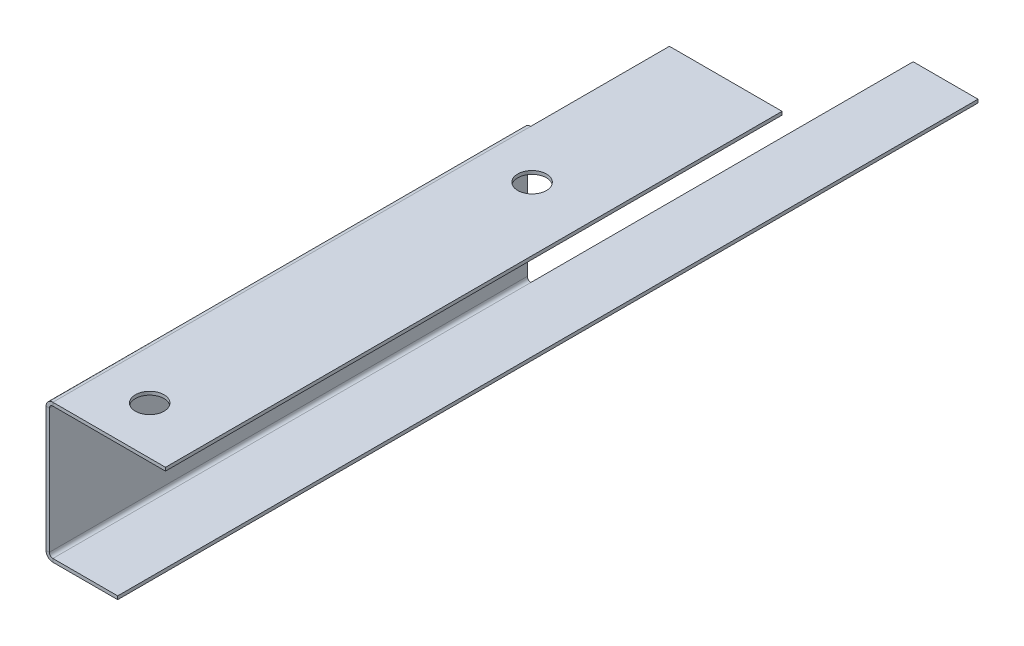
ISO-10303-21;
HEADER;
FILE_DESCRIPTION(('STEP AP214'),'2;1');
FILE_NAME('part.step','',(''),(''),'','','');
FILE_SCHEMA(('AUTOMOTIVE_DESIGN { 1 0 10303 214 1 1 1 1 }'));
ENDSEC;
DATA;
#1=APPLICATION_CONTEXT('core data for automotive mechanical design processes');
#2=APPLICATION_PROTOCOL_DEFINITION('international standard','automotive_design',2000,#1);
#3=PRODUCT_CONTEXT('',#1,'mechanical');
#4=PRODUCT('Part','Part','',(#3));
#5=PRODUCT_RELATED_PRODUCT_CATEGORY('part','',(#4));
#6=PRODUCT_DEFINITION_FORMATION('','',#4);
#7=PRODUCT_DEFINITION_CONTEXT('part definition',#1,'design');
#8=PRODUCT_DEFINITION('design','',#6,#7);
#9=PRODUCT_DEFINITION_SHAPE('','',#8);
#10=(LENGTH_UNIT() NAMED_UNIT(*) SI_UNIT(.MILLI.,.METRE.));
#11=(NAMED_UNIT(*) PLANE_ANGLE_UNIT() SI_UNIT($,.RADIAN.));
#12=(NAMED_UNIT(*) SI_UNIT($,.STERADIAN.) SOLID_ANGLE_UNIT());
#13=UNCERTAINTY_MEASURE_WITH_UNIT(LENGTH_MEASURE(1.E-05),#10,'distance_accuracy_value','');
#14=(GEOMETRIC_REPRESENTATION_CONTEXT(3) GLOBAL_UNCERTAINTY_ASSIGNED_CONTEXT((#13)) GLOBAL_UNIT_ASSIGNED_CONTEXT((#10,
#11,#12)) REPRESENTATION_CONTEXT('',''));
#15=CARTESIAN_POINT('',(0.,0.,0.));
#16=DIRECTION('',(0.,0.,1.));
#17=DIRECTION('',(1.,0.,0.));
#18=AXIS2_PLACEMENT_3D('',#15,#16,#17);
#19=CARTESIAN_POINT('',(0.,1.4366,100.));
#20=DIRECTION('',(0.,0.,1.));
#21=DIRECTION('',(1.,0.,0.));
#22=AXIS2_PLACEMENT_3D('',#19,#20,#21);
#23=PLANE('',#22);
#24=DIRECTION('',(1.,0.,0.));
#25=VECTOR('',#24,1.);
#26=CARTESIAN_POINT('',(0.,1.4366,100.));
#27=LINE('',#26,#25);
#28=CARTESIAN_POINT('',(0.,1.4366,100.));
#29=VERTEX_POINT('',#28);
#30=CARTESIAN_POINT('',(0.7,1.4366,100.));
#31=VERTEX_POINT('',#30);
#32=EDGE_CURVE('E11',#29,#31,#27,.T.);
#33=ORIENTED_EDGE('',*,*,#32,.F.);
#34=CARTESIAN_POINT('',(1.4366,1.4366,100.));
#35=DIRECTION('',(0.,0.,1.));
#36=DIRECTION('',(1.,0.,0.));
#37=AXIS2_PLACEMENT_3D('',#34,#35,#36);
#38=CIRCLE('',#37,1.4366);
#39=CARTESIAN_POINT('',(1.4366,0.,100.));
#40=VERTEX_POINT('',#39);
#41=EDGE_CURVE('E225',#40,#29,#38,.F.);
#42=ORIENTED_EDGE('',*,*,#41,.F.);
#43=DIRECTION('',(0.,-1.,0.));
#44=VECTOR('',#43,1.);
#45=CARTESIAN_POINT('',(1.4366,0.7,100.));
#46=LINE('',#45,#44);
#47=CARTESIAN_POINT('',(1.4366,0.7,100.));
#48=VERTEX_POINT('',#47);
#49=EDGE_CURVE('E46',#48,#40,#46,.T.);
#50=ORIENTED_EDGE('',*,*,#49,.F.);
#51=CARTESIAN_POINT('',(1.4366,1.4366,100.));
#52=DIRECTION('',(0.,0.,1.));
#53=DIRECTION('',(1.,0.,0.));
#54=AXIS2_PLACEMENT_3D('',#51,#52,#53);
#55=CIRCLE('',#54,0.7366);
#56=EDGE_CURVE('E137',#48,#31,#55,.F.);
#57=ORIENTED_EDGE('',*,*,#56,.T.);
#58=EDGE_LOOP('',(#33,#42,#50,#57));
#59=FACE_BOUND('',#58,.T.);
#60=ADVANCED_FACE('F38',(#59),#23,.T.);
#61=CARTESIAN_POINT('',(1.4366,0.7,100.));
#62=DIRECTION('',(0.,0.,1.));
#63=DIRECTION('',(1.,0.,0.));
#64=AXIS2_PLACEMENT_3D('',#61,#62,#63);
#65=PLANE('',#64);
#66=DIRECTION('',(0.,1.,0.));
#67=VECTOR('',#66,1.);
#68=CARTESIAN_POINT('',(0.,0.,100.));
#69=LINE('',#68,#67);
#70=CARTESIAN_POINT('',(0.,27.5634,100.));
#71=VERTEX_POINT('',#70);
#72=EDGE_CURVE('E131',#29,#71,#69,.T.);
#73=ORIENTED_EDGE('',*,*,#72,.F.);
#74=ORIENTED_EDGE('',*,*,#32,.T.);
#75=DIRECTION('',(0.,1.,0.));
#76=VECTOR('',#75,1.);
#77=CARTESIAN_POINT('',(0.7,0.,100.));
#78=LINE('',#77,#76);
#79=CARTESIAN_POINT('',(0.7,27.5634,100.));
#80=VERTEX_POINT('',#79);
#81=EDGE_CURVE('E128',#31,#80,#78,.T.);
#82=ORIENTED_EDGE('',*,*,#81,.T.);
#83=DIRECTION('',(-1.,0.,0.));
#84=VECTOR('',#83,1.);
#85=CARTESIAN_POINT('',(0.7,27.5634,100.));
#86=LINE('',#85,#84);
#87=EDGE_CURVE('E205',#80,#71,#86,.T.);
#88=ORIENTED_EDGE('',*,*,#87,.T.);
#89=EDGE_LOOP('',(#73,#74,#82,#88));
#90=FACE_BOUND('',#89,.T.);
#91=ADVANCED_FACE('F126',(#90),#65,.T.);
#92=CARTESIAN_POINT('',(1.4366,0.,0.));
#93=DIRECTION('',(0.,0.,-1.));
#94=DIRECTION('',(-1.,0.,0.));
#95=AXIS2_PLACEMENT_3D('',#92,#93,#94);
#96=PLANE('',#95);
#97=DIRECTION('',(0.,1.,0.));
#98=VECTOR('',#97,1.);
#99=CARTESIAN_POINT('',(1.4366,0.,0.));
#100=LINE('',#99,#98);
#101=CARTESIAN_POINT('',(1.4366,0.,0.));
#102=VERTEX_POINT('',#101);
#103=CARTESIAN_POINT('',(1.4366,0.7,0.));
#104=VERTEX_POINT('',#103);
#105=EDGE_CURVE('E210',#102,#104,#100,.T.);
#106=ORIENTED_EDGE('',*,*,#105,.F.);
#107=CARTESIAN_POINT('',(1.4366,1.4366,0.));
#108=DIRECTION('',(0.,0.,1.));
#109=DIRECTION('',(1.,0.,0.));
#110=AXIS2_PLACEMENT_3D('',#107,#108,#109);
#111=CIRCLE('',#110,1.4366);
#112=CARTESIAN_POINT('',(0.,1.4366,0.));
#113=VERTEX_POINT('',#112);
#114=EDGE_CURVE('E168',#102,#113,#111,.F.);
#115=ORIENTED_EDGE('',*,*,#114,.T.);
#116=DIRECTION('',(-1.,0.,0.));
#117=VECTOR('',#116,1.);
#118=CARTESIAN_POINT('',(0.7,1.4366,0.));
#119=LINE('',#118,#117);
#120=CARTESIAN_POINT('',(0.7,1.4366,0.));
#121=VERTEX_POINT('',#120);
#122=EDGE_CURVE('E208',#121,#113,#119,.T.);
#123=ORIENTED_EDGE('',*,*,#122,.F.);
#124=CARTESIAN_POINT('',(1.4366,1.4366,0.));
#125=DIRECTION('',(0.,0.,1.));
#126=DIRECTION('',(1.,0.,0.));
#127=AXIS2_PLACEMENT_3D('',#124,#125,#126);
#128=CIRCLE('',#127,0.7366);
#129=EDGE_CURVE('E149',#104,#121,#128,.F.);
#130=ORIENTED_EDGE('',*,*,#129,.F.);
#131=EDGE_LOOP('',(#106,#115,#123,#130));
#132=FACE_BOUND('',#131,.T.);
#133=ADVANCED_FACE('F338',(#132),#96,.T.);
#134=CARTESIAN_POINT('',(1.4366,29.,100.));
#135=DIRECTION('',(0.,0.,1.));
#136=DIRECTION('',(1.,0.,0.));
#137=AXIS2_PLACEMENT_3D('',#134,#135,#136);
#138=PLANE('',#137);
#139=DIRECTION('',(0.,-1.,0.));
#140=VECTOR('',#139,1.);
#141=CARTESIAN_POINT('',(1.4366,29.,100.));
#142=LINE('',#141,#140);
#143=CARTESIAN_POINT('',(1.4366,29.,100.));
#144=VERTEX_POINT('',#143);
#145=CARTESIAN_POINT('',(1.4366,28.3,100.));
#146=VERTEX_POINT('',#145);
#147=EDGE_CURVE('E54',#144,#146,#142,.T.);
#148=ORIENTED_EDGE('',*,*,#147,.F.);
#149=CARTESIAN_POINT('',(1.4366,27.5634,100.));
#150=DIRECTION('',(0.,0.,1.));
#151=DIRECTION('',(1.,0.,0.));
#152=AXIS2_PLACEMENT_3D('',#149,#150,#151);
#153=CIRCLE('',#152,1.4366);
#154=EDGE_CURVE('E237',#71,#144,#153,.F.);
#155=ORIENTED_EDGE('',*,*,#154,.F.);
#156=ORIENTED_EDGE('',*,*,#87,.F.);
#157=CARTESIAN_POINT('',(1.4366,27.5634,100.));
#158=DIRECTION('',(0.,0.,1.));
#159=DIRECTION('',(1.,0.,0.));
#160=AXIS2_PLACEMENT_3D('',#157,#158,#159);
#161=CIRCLE('',#160,0.7366);
#162=EDGE_CURVE('E157',#80,#146,#161,.F.);
#163=ORIENTED_EDGE('',*,*,#162,.T.);
#164=EDGE_LOOP('',(#148,#155,#156,#163));
#165=FACE_BOUND('',#164,.T.);
#166=ADVANCED_FACE('F332',(#165),#138,.T.);
#167=CARTESIAN_POINT('',(0.7,27.5634,100.));
#168=DIRECTION('',(0.,0.,1.));
#169=DIRECTION('',(1.,0.,0.));
#170=AXIS2_PLACEMENT_3D('',#167,#168,#169);
#171=PLANE('',#170);
#172=DIRECTION('',(1.,0.,0.));
#173=VECTOR('',#172,1.);
#174=CARTESIAN_POINT('',(0.,29.,100.));
#175=LINE('',#174,#173);
#176=CARTESIAN_POINT('',(25.,29.,100.));
#177=VERTEX_POINT('',#176);
#178=EDGE_CURVE('E240',#144,#177,#175,.T.);
#179=ORIENTED_EDGE('',*,*,#178,.F.);
#180=ORIENTED_EDGE('',*,*,#147,.T.);
#181=DIRECTION('',(1.,0.,0.));
#182=VECTOR('',#181,1.);
#183=CARTESIAN_POINT('',(0.,28.3,100.));
#184=LINE('',#183,#182);
#185=CARTESIAN_POINT('',(25.,28.3,100.));
#186=VERTEX_POINT('',#185);
#187=EDGE_CURVE('E95',#146,#186,#184,.T.);
#188=ORIENTED_EDGE('',*,*,#187,.T.);
#189=DIRECTION('',(0.,-1.,0.));
#190=VECTOR('',#189,1.);
#191=CARTESIAN_POINT('',(25.,29.,100.));
#192=LINE('',#191,#190);
#193=EDGE_CURVE('E243',#177,#186,#192,.T.);
#194=ORIENTED_EDGE('',*,*,#193,.F.);
#195=EDGE_LOOP('',(#179,#180,#188,#194));
#196=FACE_BOUND('',#195,.T.);
#197=ADVANCED_FACE('F328',(#196),#171,.T.);
#198=CARTESIAN_POINT('',(0.,27.5634,0.));
#199=DIRECTION('',(0.,0.,-1.));
#200=DIRECTION('',(-1.,0.,0.));
#201=AXIS2_PLACEMENT_3D('',#198,#199,#200);
#202=PLANE('',#201);
#203=DIRECTION('',(1.,0.,0.));
#204=VECTOR('',#203,1.);
#205=CARTESIAN_POINT('',(0.,27.5634,0.));
#206=LINE('',#205,#204);
#207=CARTESIAN_POINT('',(0.,27.5634,0.));
#208=VERTEX_POINT('',#207);
#209=CARTESIAN_POINT('',(0.7,27.5634,0.));
#210=VERTEX_POINT('',#209);
#211=EDGE_CURVE('E81',#208,#210,#206,.T.);
#212=ORIENTED_EDGE('',*,*,#211,.F.);
#213=CARTESIAN_POINT('',(1.4366,27.5634,0.));
#214=DIRECTION('',(0.,0.,1.));
#215=DIRECTION('',(1.,0.,0.));
#216=AXIS2_PLACEMENT_3D('',#213,#214,#215);
#217=CIRCLE('',#216,1.4366);
#218=CARTESIAN_POINT('',(1.4366,29.,0.));
#219=VERTEX_POINT('',#218);
#220=EDGE_CURVE('E163',#208,#219,#217,.F.);
#221=ORIENTED_EDGE('',*,*,#220,.T.);
#222=DIRECTION('',(0.,1.,0.));
#223=VECTOR('',#222,1.);
#224=CARTESIAN_POINT('',(1.4366,28.3,0.));
#225=LINE('',#224,#223);
#226=CARTESIAN_POINT('',(1.4366,28.3,0.));
#227=VERTEX_POINT('',#226);
#228=EDGE_CURVE('E89',#227,#219,#225,.T.);
#229=ORIENTED_EDGE('',*,*,#228,.F.);
#230=CARTESIAN_POINT('',(1.4366,27.5634,0.));
#231=DIRECTION('',(0.,0.,1.));
#232=DIRECTION('',(1.,0.,0.));
#233=AXIS2_PLACEMENT_3D('',#230,#231,#232);
#234=CIRCLE('',#233,0.7366);
#235=EDGE_CURVE('E174',#210,#227,#234,.F.);
#236=ORIENTED_EDGE('',*,*,#235,.F.);
#237=EDGE_LOOP('',(#212,#221,#229,#236));
#238=FACE_BOUND('',#237,.T.);
#239=ADVANCED_FACE('F383',(#238),#202,.T.);
#240=CARTESIAN_POINT('',(1.4366,28.3,0.));
#241=DIRECTION('',(0.,0.,-1.));
#242=DIRECTION('',(-1.,0.,0.));
#243=AXIS2_PLACEMENT_3D('',#240,#241,#242);
#244=PLANE('',#243);
#245=DIRECTION('',(0.,1.,0.));
#246=VECTOR('',#245,1.);
#247=CARTESIAN_POINT('',(0.,0.,0.));
#248=LINE('',#247,#246);
#249=EDGE_CURVE('E165',#113,#208,#248,.T.);
#250=ORIENTED_EDGE('',*,*,#249,.T.);
#251=ORIENTED_EDGE('',*,*,#211,.T.);
#252=DIRECTION('',(0.,1.,0.));
#253=VECTOR('',#252,1.);
#254=CARTESIAN_POINT('',(0.7,0.,0.));
#255=LINE('',#254,#253);
#256=EDGE_CURVE('E172',#121,#210,#255,.T.);
#257=ORIENTED_EDGE('',*,*,#256,.F.);
#258=ORIENTED_EDGE('',*,*,#122,.T.);
#259=EDGE_LOOP('',(#250,#251,#257,#258));
#260=FACE_BOUND('',#259,.T.);
#261=ADVANCED_FACE('F386',(#260),#244,.T.);
#262=CARTESIAN_POINT('',(0.,28.3,100.));
#263=DIRECTION('',(0.,1.,0.));
#264=DIRECTION('',(0.,0.,1.));
#265=AXIS2_PLACEMENT_3D('',#262,#263,#264);
#266=PLANE('',#265);
#267=CARTESIAN_POINT('',(11.6999999999997,28.3,10.));
#268=DIRECTION('',(0.,1.,0.));
#269=DIRECTION('',(0.,0.,1.));
#270=AXIS2_PLACEMENT_3D('',#267,#268,#269);
#271=CIRCLE('',#270,3.);
#272=CARTESIAN_POINT('',(11.6999999999997,28.3,13.));
#273=VERTEX_POINT('',#272);
#274=EDGE_CURVE('E284',#273,#273,#271,.T.);
#275=ORIENTED_EDGE('',*,*,#274,.T.);
#276=EDGE_LOOP('',(#275));
#277=FACE_BOUND('',#276,.T.);
#278=CARTESIAN_POINT('',(11.7,28.3,90.));
#279=DIRECTION('',(0.,1.,0.));
#280=DIRECTION('',(0.,0.,1.));
#281=AXIS2_PLACEMENT_3D('',#278,#279,#280);
#282=CIRCLE('',#281,3.);
#283=CARTESIAN_POINT('',(11.7,28.3,93.));
#284=VERTEX_POINT('',#283);
#285=EDGE_CURVE('E276',#284,#284,#282,.T.);
#286=ORIENTED_EDGE('',*,*,#285,.T.);
#287=EDGE_LOOP('',(#286));
#288=FACE_BOUND('',#287,.T.);
#289=DIRECTION('',(0.,0.,-1.));
#290=VECTOR('',#289,1.);
#291=CARTESIAN_POINT('',(1.4366,28.3,100.));
#292=LINE('',#291,#290);
#293=EDGE_CURVE('E159',#146,#227,#292,.T.);
#294=ORIENTED_EDGE('',*,*,#293,.T.);
#295=DIRECTION('',(0.,0.,1.));
#296=VECTOR('',#295,1.);
#297=CARTESIAN_POINT('',(1.4366,28.3,0.));
#298=LINE('',#297,#296);
#299=CARTESIAN_POINT('',(1.4366,28.3,-29.));
#300=VERTEX_POINT('',#299);
#301=EDGE_CURVE('E256',#300,#227,#298,.T.);
#302=ORIENTED_EDGE('',*,*,#301,.F.);
#303=DIRECTION('',(-1.,0.,0.));
#304=VECTOR('',#303,1.);
#305=CARTESIAN_POINT('',(1.4366,28.3,-29.));
#306=LINE('',#305,#304);
#307=CARTESIAN_POINT('',(25.,28.3,-29.));
#308=VERTEX_POINT('',#307);
#309=EDGE_CURVE('E250',#308,#300,#306,.T.);
#310=ORIENTED_EDGE('',*,*,#309,.F.);
#311=DIRECTION('',(0.,0.,-1.));
#312=VECTOR('',#311,1.);
#313=CARTESIAN_POINT('',(25.,28.3,100.));
#314=LINE('',#313,#312);
#315=EDGE_CURVE('E200',#186,#308,#314,.T.);
#316=ORIENTED_EDGE('',*,*,#315,.F.);
#317=ORIENTED_EDGE('',*,*,#187,.F.);
#318=EDGE_LOOP('',(#294,#302,#310,#316,#317));
#319=FACE_BOUND('',#318,.T.);
#320=ADVANCED_FACE('F293',(#277,#288,#319),#266,.F.);
#321=CARTESIAN_POINT('',(25.,29.,100.));
#322=DIRECTION('',(1.,0.,0.));
#323=DIRECTION('',(0.,0.,-1.));
#324=AXIS2_PLACEMENT_3D('',#321,#322,#323);
#325=PLANE('',#324);
#326=ORIENTED_EDGE('',*,*,#315,.T.);
#327=DIRECTION('',(0.,1.,0.));
#328=VECTOR('',#327,1.);
#329=CARTESIAN_POINT('',(25.,28.3,-29.));
#330=LINE('',#329,#328);
#331=CARTESIAN_POINT('',(25.,29.,-29.));
#332=VERTEX_POINT('',#331);
#333=EDGE_CURVE('E247',#308,#332,#330,.T.);
#334=ORIENTED_EDGE('',*,*,#333,.T.);
#335=DIRECTION('',(0.,0.,-1.));
#336=VECTOR('',#335,1.);
#337=CARTESIAN_POINT('',(25.,29.,100.));
#338=LINE('',#337,#336);
#339=EDGE_CURVE('E197',#177,#332,#338,.T.);
#340=ORIENTED_EDGE('',*,*,#339,.F.);
#341=ORIENTED_EDGE('',*,*,#193,.T.);
#342=EDGE_LOOP('',(#326,#334,#340,#341));
#343=FACE_BOUND('',#342,.T.);
#344=ADVANCED_FACE('F307',(#343),#325,.T.);
#345=CARTESIAN_POINT('',(0.,29.,100.));
#346=DIRECTION('',(0.,1.,0.));
#347=DIRECTION('',(0.,0.,1.));
#348=AXIS2_PLACEMENT_3D('',#345,#346,#347);
#349=PLANE('',#348);
#350=CARTESIAN_POINT('',(11.6999999999997,29.,10.));
#351=DIRECTION('',(0.,1.,0.));
#352=DIRECTION('',(0.,0.,1.));
#353=AXIS2_PLACEMENT_3D('',#350,#351,#352);
#354=CIRCLE('',#353,3.);
#355=CARTESIAN_POINT('',(11.6999999999997,29.,13.));
#356=VERTEX_POINT('',#355);
#357=EDGE_CURVE('E287',#356,#356,#354,.T.);
#358=ORIENTED_EDGE('',*,*,#357,.F.);
#359=EDGE_LOOP('',(#358));
#360=FACE_BOUND('',#359,.T.);
#361=CARTESIAN_POINT('',(11.7,29.,90.));
#362=DIRECTION('',(0.,1.,0.));
#363=DIRECTION('',(0.,0.,1.));
#364=AXIS2_PLACEMENT_3D('',#361,#362,#363);
#365=CIRCLE('',#364,3.);
#366=CARTESIAN_POINT('',(11.7,29.,93.));
#367=VERTEX_POINT('',#366);
#368=EDGE_CURVE('E281',#367,#367,#365,.T.);
#369=ORIENTED_EDGE('',*,*,#368,.F.);
#370=EDGE_LOOP('',(#369));
#371=FACE_BOUND('',#370,.T.);
#372=ORIENTED_EDGE('',*,*,#339,.T.);
#373=DIRECTION('',(-1.,0.,0.));
#374=VECTOR('',#373,1.);
#375=CARTESIAN_POINT('',(1.4366,29.,-29.));
#376=LINE('',#375,#374);
#377=CARTESIAN_POINT('',(1.4366,29.,-29.));
#378=VERTEX_POINT('',#377);
#379=EDGE_CURVE('E253',#332,#378,#376,.T.);
#380=ORIENTED_EDGE('',*,*,#379,.T.);
#381=DIRECTION('',(0.,0.,1.));
#382=VECTOR('',#381,1.);
#383=CARTESIAN_POINT('',(1.4366,29.,0.));
#384=LINE('',#383,#382);
#385=EDGE_CURVE('E257',#378,#219,#384,.T.);
#386=ORIENTED_EDGE('',*,*,#385,.T.);
#387=DIRECTION('',(0.,0.,-1.));
#388=VECTOR('',#387,1.);
#389=CARTESIAN_POINT('',(1.4366,29.,100.));
#390=LINE('',#389,#388);
#391=EDGE_CURVE('E195',#144,#219,#390,.T.);
#392=ORIENTED_EDGE('',*,*,#391,.F.);
#393=ORIENTED_EDGE('',*,*,#178,.T.);
#394=EDGE_LOOP('',(#372,#380,#386,#392,#393));
#395=FACE_BOUND('',#394,.T.);
#396=ADVANCED_FACE('F303',(#360,#371,#395),#349,.T.);
#397=CARTESIAN_POINT('',(1.4366,27.5634,100.));
#398=DIRECTION('',(0.,0.,-1.));
#399=DIRECTION('',(-1.,0.,0.));
#400=AXIS2_PLACEMENT_3D('',#397,#398,#399);
#401=CYLINDRICAL_SURFACE('',#400,1.4366);
#402=ORIENTED_EDGE('',*,*,#220,.F.);
#403=DIRECTION('',(0.,0.,-1.));
#404=VECTOR('',#403,1.);
#405=CARTESIAN_POINT('',(0.,27.5634,100.));
#406=LINE('',#405,#404);
#407=EDGE_CURVE('E192',#71,#208,#406,.T.);
#408=ORIENTED_EDGE('',*,*,#407,.F.);
#409=ORIENTED_EDGE('',*,*,#154,.T.);
#410=ORIENTED_EDGE('',*,*,#391,.T.);
#411=EDGE_LOOP('',(#402,#408,#409,#410));
#412=FACE_BOUND('',#411,.T.);
#413=ADVANCED_FACE('F306',(#412),#401,.T.);
#414=CARTESIAN_POINT('',(0.,0.,100.));
#415=DIRECTION('',(-1.,0.,0.));
#416=DIRECTION('',(0.,0.,1.));
#417=AXIS2_PLACEMENT_3D('',#414,#415,#416);
#418=PLANE('',#417);
#419=ORIENTED_EDGE('',*,*,#249,.F.);
#420=DIRECTION('',(0.,0.,-1.));
#421=VECTOR('',#420,1.);
#422=CARTESIAN_POINT('',(0.,1.4366,100.));
#423=LINE('',#422,#421);
#424=EDGE_CURVE('E189',#29,#113,#423,.T.);
#425=ORIENTED_EDGE('',*,*,#424,.F.);
#426=ORIENTED_EDGE('',*,*,#72,.T.);
#427=ORIENTED_EDGE('',*,*,#407,.T.);
#428=EDGE_LOOP('',(#419,#425,#426,#427));
#429=FACE_BOUND('',#428,.T.);
#430=ADVANCED_FACE('F335',(#429),#418,.T.);
#431=CARTESIAN_POINT('',(1.4366,1.4366,100.));
#432=DIRECTION('',(0.,0.,-1.));
#433=DIRECTION('',(-1.,0.,0.));
#434=AXIS2_PLACEMENT_3D('',#431,#432,#433);
#435=CYLINDRICAL_SURFACE('',#434,1.4366);
#436=ORIENTED_EDGE('',*,*,#114,.F.);
#437=DIRECTION('',(0.,0.,-1.));
#438=VECTOR('',#437,1.);
#439=CARTESIAN_POINT('',(1.4366,0.,100.));
#440=LINE('',#439,#438);
#441=EDGE_CURVE('E186',#40,#102,#440,.T.);
#442=ORIENTED_EDGE('',*,*,#441,.F.);
#443=ORIENTED_EDGE('',*,*,#41,.T.);
#444=ORIENTED_EDGE('',*,*,#424,.T.);
#445=EDGE_LOOP('',(#436,#442,#443,#444));
#446=FACE_BOUND('',#445,.T.);
#447=ADVANCED_FACE('F224',(#446),#435,.T.);
#448=CARTESIAN_POINT('',(0.,0.,100.));
#449=DIRECTION('',(0.,-1.,0.));
#450=DIRECTION('',(0.,0.,-1.));
#451=AXIS2_PLACEMENT_3D('',#448,#449,#450);
#452=PLANE('',#451);
#453=ORIENTED_EDGE('',*,*,#441,.T.);
#454=DIRECTION('',(0.,0.,-1.));
#455=VECTOR('',#454,1.);
#456=CARTESIAN_POINT('',(1.4366,0.,0.));
#457=LINE('',#456,#455);
#458=CARTESIAN_POINT('',(1.4366,0.,-80.));
#459=VERTEX_POINT('',#458);
#460=EDGE_CURVE('E274',#102,#459,#457,.T.);
#461=ORIENTED_EDGE('',*,*,#460,.T.);
#462=DIRECTION('',(1.,0.,0.));
#463=VECTOR('',#462,1.);
#464=CARTESIAN_POINT('',(15.,0.,-80.));
#465=LINE('',#464,#463);
#466=CARTESIAN_POINT('',(15.,0.,-80.));
#467=VERTEX_POINT('',#466);
#468=EDGE_CURVE('E271',#459,#467,#465,.T.);
#469=ORIENTED_EDGE('',*,*,#468,.T.);
#470=DIRECTION('',(0.,0.,-1.));
#471=VECTOR('',#470,1.);
#472=CARTESIAN_POINT('',(15.,0.,100.));
#473=LINE('',#472,#471);
#474=CARTESIAN_POINT('',(15.,0.,100.));
#475=VERTEX_POINT('',#474);
#476=EDGE_CURVE('E183',#475,#467,#473,.T.);
#477=ORIENTED_EDGE('',*,*,#476,.F.);
#478=DIRECTION('',(-1.,0.,0.));
#479=VECTOR('',#478,1.);
#480=CARTESIAN_POINT('',(0.,0.,100.));
#481=LINE('',#480,#479);
#482=EDGE_CURVE('E218',#475,#40,#481,.T.);
#483=ORIENTED_EDGE('',*,*,#482,.T.);
#484=EDGE_LOOP('',(#453,#461,#469,#477,#483));
#485=FACE_BOUND('',#484,.T.);
#486=ADVANCED_FACE('F230',(#485),#452,.T.);
#487=CARTESIAN_POINT('',(15.,0.7,100.));
#488=DIRECTION('',(1.,0.,0.));
#489=DIRECTION('',(0.,0.,-1.));
#490=AXIS2_PLACEMENT_3D('',#487,#488,#489);
#491=PLANE('',#490);
#492=ORIENTED_EDGE('',*,*,#476,.T.);
#493=DIRECTION('',(0.,-1.,0.));
#494=VECTOR('',#493,1.);
#495=CARTESIAN_POINT('',(15.,0.7,-80.));
#496=LINE('',#495,#494);
#497=CARTESIAN_POINT('',(15.,0.7,-80.));
#498=VERTEX_POINT('',#497);
#499=EDGE_CURVE('E260',#498,#467,#496,.T.);
#500=ORIENTED_EDGE('',*,*,#499,.F.);
#501=DIRECTION('',(0.,0.,-1.));
#502=VECTOR('',#501,1.);
#503=CARTESIAN_POINT('',(15.,0.7,100.));
#504=LINE('',#503,#502);
#505=CARTESIAN_POINT('',(15.,0.7,100.));
#506=VERTEX_POINT('',#505);
#507=EDGE_CURVE('E180',#506,#498,#504,.T.);
#508=ORIENTED_EDGE('',*,*,#507,.F.);
#509=DIRECTION('',(0.,-1.,0.));
#510=VECTOR('',#509,1.);
#511=CARTESIAN_POINT('',(15.,0.7,100.));
#512=LINE('',#511,#510);
#513=EDGE_CURVE('E232',#506,#475,#512,.T.);
#514=ORIENTED_EDGE('',*,*,#513,.T.);
#515=EDGE_LOOP('',(#492,#500,#508,#514));
#516=FACE_BOUND('',#515,.T.);
#517=ADVANCED_FACE('F361',(#516),#491,.T.);
#518=CARTESIAN_POINT('',(0.,0.7,100.));
#519=DIRECTION('',(0.,-1.,0.));
#520=DIRECTION('',(0.,0.,-1.));
#521=AXIS2_PLACEMENT_3D('',#518,#519,#520);
#522=PLANE('',#521);
#523=ORIENTED_EDGE('',*,*,#507,.T.);
#524=DIRECTION('',(1.,0.,0.));
#525=VECTOR('',#524,1.);
#526=CARTESIAN_POINT('',(15.,0.7,-80.));
#527=LINE('',#526,#525);
#528=CARTESIAN_POINT('',(1.4366,0.7,-80.));
#529=VERTEX_POINT('',#528);
#530=EDGE_CURVE('E268',#529,#498,#527,.T.);
#531=ORIENTED_EDGE('',*,*,#530,.F.);
#532=DIRECTION('',(0.,0.,-1.));
#533=VECTOR('',#532,1.);
#534=CARTESIAN_POINT('',(1.4366,0.7,0.));
#535=LINE('',#534,#533);
#536=EDGE_CURVE('E273',#104,#529,#535,.T.);
#537=ORIENTED_EDGE('',*,*,#536,.F.);
#538=DIRECTION('',(0.,0.,-1.));
#539=VECTOR('',#538,1.);
#540=CARTESIAN_POINT('',(1.4366,0.7,100.));
#541=LINE('',#540,#539);
#542=EDGE_CURVE('E151',#48,#104,#541,.T.);
#543=ORIENTED_EDGE('',*,*,#542,.F.);
#544=DIRECTION('',(1.,0.,0.));
#545=VECTOR('',#544,1.);
#546=CARTESIAN_POINT('',(0.,0.7,100.));
#547=LINE('',#546,#545);
#548=EDGE_CURVE('E142',#506,#48,#547,.F.);
#549=ORIENTED_EDGE('',*,*,#548,.F.);
#550=EDGE_LOOP('',(#523,#531,#537,#543,#549));
#551=FACE_BOUND('',#550,.T.);
#552=ADVANCED_FACE('F347',(#551),#522,.F.);
#553=CARTESIAN_POINT('',(1.4366,1.4366,100.));
#554=DIRECTION('',(0.,0.,-1.));
#555=DIRECTION('',(-1.,0.,0.));
#556=AXIS2_PLACEMENT_3D('',#553,#554,#555);
#557=CYLINDRICAL_SURFACE('',#556,0.7366);
#558=ORIENTED_EDGE('',*,*,#129,.T.);
#559=DIRECTION('',(0.,0.,-1.));
#560=VECTOR('',#559,1.);
#561=CARTESIAN_POINT('',(0.7,1.4366,100.));
#562=LINE('',#561,#560);
#563=EDGE_CURVE('E146',#31,#121,#562,.T.);
#564=ORIENTED_EDGE('',*,*,#563,.F.);
#565=ORIENTED_EDGE('',*,*,#56,.F.);
#566=ORIENTED_EDGE('',*,*,#542,.T.);
#567=EDGE_LOOP('',(#558,#564,#565,#566));
#568=FACE_BOUND('',#567,.T.);
#569=ADVANCED_FACE('F147',(#568),#557,.F.);
#570=CARTESIAN_POINT('',(0.7,0.,100.));
#571=DIRECTION('',(-1.,0.,0.));
#572=DIRECTION('',(0.,0.,1.));
#573=AXIS2_PLACEMENT_3D('',#570,#571,#572);
#574=PLANE('',#573);
#575=ORIENTED_EDGE('',*,*,#256,.T.);
#576=DIRECTION('',(0.,0.,-1.));
#577=VECTOR('',#576,1.);
#578=CARTESIAN_POINT('',(0.7,27.5634,100.));
#579=LINE('',#578,#577);
#580=EDGE_CURVE('E152',#80,#210,#579,.T.);
#581=ORIENTED_EDGE('',*,*,#580,.F.);
#582=ORIENTED_EDGE('',*,*,#81,.F.);
#583=ORIENTED_EDGE('',*,*,#563,.T.);
#584=EDGE_LOOP('',(#575,#581,#582,#583));
#585=FACE_BOUND('',#584,.T.);
#586=ADVANCED_FACE('F154',(#585),#574,.F.);
#587=CARTESIAN_POINT('',(1.4366,27.5634,100.));
#588=DIRECTION('',(0.,0.,-1.));
#589=DIRECTION('',(-1.,0.,0.));
#590=AXIS2_PLACEMENT_3D('',#587,#588,#589);
#591=CYLINDRICAL_SURFACE('',#590,0.7366);
#592=ORIENTED_EDGE('',*,*,#235,.T.);
#593=ORIENTED_EDGE('',*,*,#293,.F.);
#594=ORIENTED_EDGE('',*,*,#162,.F.);
#595=ORIENTED_EDGE('',*,*,#580,.T.);
#596=EDGE_LOOP('',(#592,#593,#594,#595));
#597=FACE_BOUND('',#596,.T.);
#598=ADVANCED_FACE('F521',(#597),#591,.F.);
#599=CARTESIAN_POINT('',(1.4366,27.5634,100.));
#600=DIRECTION('',(0.,0.,1.));
#601=DIRECTION('',(1.,0.,0.));
#602=AXIS2_PLACEMENT_3D('',#599,#600,#601);
#603=PLANE('',#602);
#604=ORIENTED_EDGE('',*,*,#548,.T.);
#605=ORIENTED_EDGE('',*,*,#49,.T.);
#606=ORIENTED_EDGE('',*,*,#482,.F.);
#607=ORIENTED_EDGE('',*,*,#513,.F.);
#608=EDGE_LOOP('',(#604,#605,#606,#607));
#609=FACE_BOUND('',#608,.T.);
#610=ADVANCED_FACE('F215',(#609),#603,.T.);
#611=CARTESIAN_POINT('',(1.4366,28.3,0.));
#612=DIRECTION('',(-1.,0.,0.));
#613=DIRECTION('',(0.,0.,1.));
#614=AXIS2_PLACEMENT_3D('',#611,#612,#613);
#615=PLANE('',#614);
#616=ORIENTED_EDGE('',*,*,#385,.F.);
#617=DIRECTION('',(0.,1.,0.));
#618=VECTOR('',#617,1.);
#619=CARTESIAN_POINT('',(1.4366,28.3,-29.));
#620=LINE('',#619,#618);
#621=EDGE_CURVE('E166',#300,#378,#620,.T.);
#622=ORIENTED_EDGE('',*,*,#621,.F.);
#623=ORIENTED_EDGE('',*,*,#301,.T.);
#624=ORIENTED_EDGE('',*,*,#228,.T.);
#625=EDGE_LOOP('',(#616,#622,#623,#624));
#626=FACE_BOUND('',#625,.T.);
#627=ADVANCED_FACE('F325',(#626),#615,.T.);
#628=CARTESIAN_POINT('',(1.4366,28.3,-29.));
#629=DIRECTION('',(0.,0.,-1.));
#630=DIRECTION('',(-1.,0.,0.));
#631=AXIS2_PLACEMENT_3D('',#628,#629,#630);
#632=PLANE('',#631);
#633=ORIENTED_EDGE('',*,*,#379,.F.);
#634=ORIENTED_EDGE('',*,*,#333,.F.);
#635=ORIENTED_EDGE('',*,*,#309,.T.);
#636=ORIENTED_EDGE('',*,*,#621,.T.);
#637=EDGE_LOOP('',(#633,#634,#635,#636));
#638=FACE_BOUND('',#637,.T.);
#639=ADVANCED_FACE('F320',(#638),#632,.T.);
#640=CARTESIAN_POINT('',(15.,0.7,-80.));
#641=DIRECTION('',(0.,0.,-1.));
#642=DIRECTION('',(-1.,0.,0.));
#643=AXIS2_PLACEMENT_3D('',#640,#641,#642);
#644=PLANE('',#643);
#645=ORIENTED_EDGE('',*,*,#468,.F.);
#646=DIRECTION('',(0.,-1.,0.));
#647=VECTOR('',#646,1.);
#648=CARTESIAN_POINT('',(1.4366,0.7,-80.));
#649=LINE('',#648,#647);
#650=EDGE_CURVE('E265',#529,#459,#649,.T.);
#651=ORIENTED_EDGE('',*,*,#650,.F.);
#652=ORIENTED_EDGE('',*,*,#530,.T.);
#653=ORIENTED_EDGE('',*,*,#499,.T.);
#654=EDGE_LOOP('',(#645,#651,#652,#653));
#655=FACE_BOUND('',#654,.T.);
#656=ADVANCED_FACE('F354',(#655),#644,.T.);
#657=CARTESIAN_POINT('',(1.4366,0.7,0.));
#658=DIRECTION('',(-1.,0.,0.));
#659=DIRECTION('',(0.,0.,1.));
#660=AXIS2_PLACEMENT_3D('',#657,#658,#659);
#661=PLANE('',#660);
#662=ORIENTED_EDGE('',*,*,#460,.F.);
#663=ORIENTED_EDGE('',*,*,#105,.T.);
#664=ORIENTED_EDGE('',*,*,#536,.T.);
#665=ORIENTED_EDGE('',*,*,#650,.T.);
#666=EDGE_LOOP('',(#662,#663,#664,#665));
#667=FACE_BOUND('',#666,.T.);
#668=ADVANCED_FACE('F343',(#667),#661,.T.);
#669=CARTESIAN_POINT('',(11.7,28.3,90.));
#670=DIRECTION('',(0.,1.,0.));
#671=DIRECTION('',(0.,0.,1.));
#672=AXIS2_PLACEMENT_3D('',#669,#670,#671);
#673=CYLINDRICAL_SURFACE('',#672,3.);
#674=ORIENTED_EDGE('',*,*,#285,.F.);
#675=EDGE_LOOP('',(#674));
#676=FACE_BOUND('',#675,.T.);
#677=ORIENTED_EDGE('',*,*,#368,.T.);
#678=EDGE_LOOP('',(#677));
#679=FACE_BOUND('',#678,.T.);
#680=ADVANCED_FACE('F299',(#676,#679),#673,.F.);
#681=CARTESIAN_POINT('',(11.6999999999997,28.3,10.));
#682=DIRECTION('',(0.,1.,0.));
#683=DIRECTION('',(0.,0.,1.));
#684=AXIS2_PLACEMENT_3D('',#681,#682,#683);
#685=CYLINDRICAL_SURFACE('',#684,3.);
#686=ORIENTED_EDGE('',*,*,#274,.F.);
#687=EDGE_LOOP('',(#686));
#688=FACE_BOUND('',#687,.T.);
#689=ORIENTED_EDGE('',*,*,#357,.T.);
#690=EDGE_LOOP('',(#689));
#691=FACE_BOUND('',#690,.T.);
#692=ADVANCED_FACE('F296',(#688,#691),#685,.F.);
#693=CLOSED_SHELL('',(#60,#91,#133,#166,#197,#239,#261,#320,#344,#396,#413,#430,#447,#486,#517,
#552,#569,#586,#598,#610,#627,#639,#656,#668,#680,#692));
#694=MANIFOLD_SOLID_BREP('B2',#693);
#695=ADVANCED_BREP_SHAPE_REPRESENTATION('',(#18,#694),#14);
#696=SHAPE_DEFINITION_REPRESENTATION(#9,#695);
ENDSEC;
END-ISO-10303-21;
